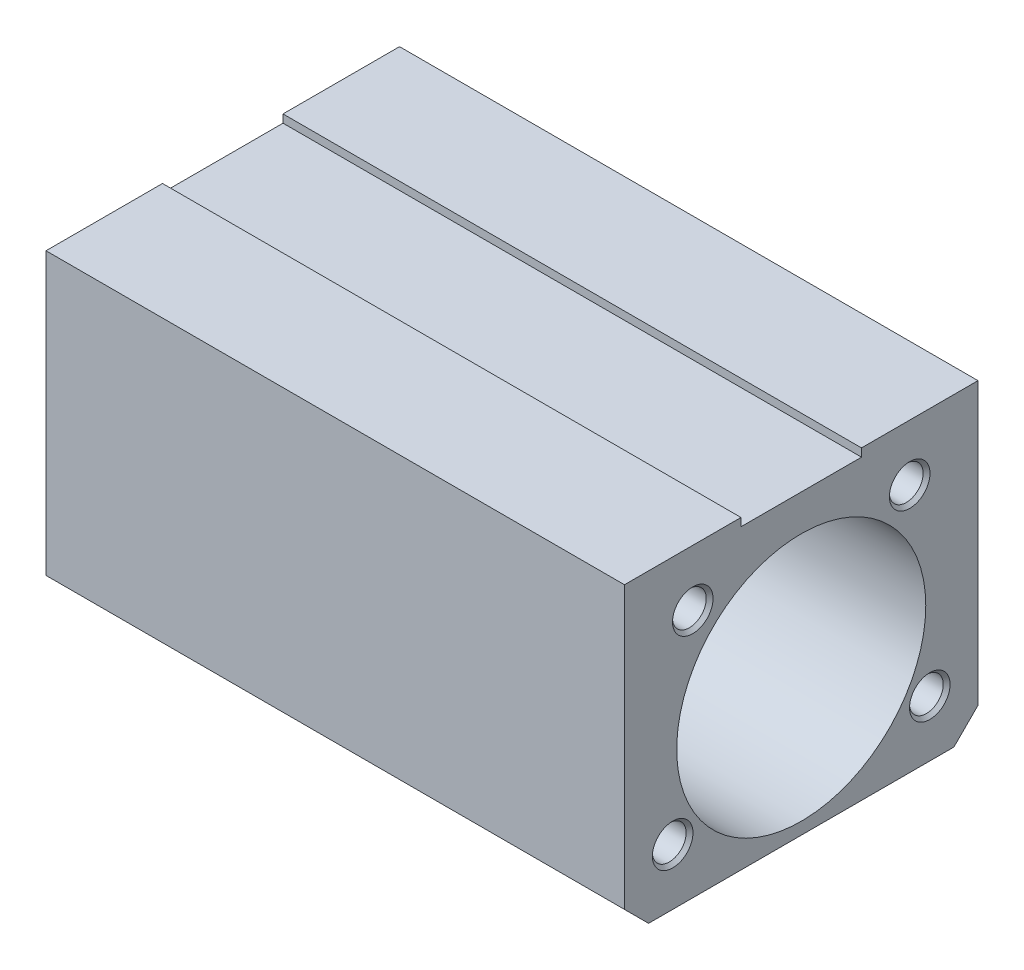
ISO-10303-21;
HEADER;
FILE_DESCRIPTION(('STEP AP214'),'2;1');
FILE_NAME('part.step','',(''),(''),'','','');
FILE_SCHEMA(('AUTOMOTIVE_DESIGN { 1 0 10303 214 1 1 1 1 }'));
ENDSEC;
DATA;
#1=APPLICATION_CONTEXT('core data for automotive mechanical design processes');
#2=APPLICATION_PROTOCOL_DEFINITION('international standard','automotive_design',2000,#1);
#3=PRODUCT_CONTEXT('',#1,'mechanical');
#4=PRODUCT('Part','Part','',(#3));
#5=PRODUCT_RELATED_PRODUCT_CATEGORY('part','',(#4));
#6=PRODUCT_DEFINITION_FORMATION('','',#4);
#7=PRODUCT_DEFINITION_CONTEXT('part definition',#1,'design');
#8=PRODUCT_DEFINITION('design','',#6,#7);
#9=PRODUCT_DEFINITION_SHAPE('','',#8);
#10=(LENGTH_UNIT() NAMED_UNIT(*) SI_UNIT(.MILLI.,.METRE.));
#11=(NAMED_UNIT(*) PLANE_ANGLE_UNIT() SI_UNIT($,.RADIAN.));
#12=(NAMED_UNIT(*) SI_UNIT($,.STERADIAN.) SOLID_ANGLE_UNIT());
#13=UNCERTAINTY_MEASURE_WITH_UNIT(LENGTH_MEASURE(1.E-05),#10,'distance_accuracy_value','');
#14=(GEOMETRIC_REPRESENTATION_CONTEXT(3) GLOBAL_UNCERTAINTY_ASSIGNED_CONTEXT((#13)) GLOBAL_UNIT_ASSIGNED_CONTEXT((#10,
#11,#12)) REPRESENTATION_CONTEXT('',''));
#15=CARTESIAN_POINT('',(0.,0.,0.));
#16=DIRECTION('',(0.,0.,1.));
#17=DIRECTION('',(1.,0.,0.));
#18=AXIS2_PLACEMENT_3D('',#15,#16,#17);
#19=CARTESIAN_POINT('',(-72.,38.,0.));
#20=DIRECTION('',(0.,1.,0.));
#21=DIRECTION('',(0.,0.,1.));
#22=AXIS2_PLACEMENT_3D('',#19,#20,#21);
#23=PLANE('',#22);
#24=DIRECTION('',(1.,0.,0.));
#25=VECTOR('',#24,1.);
#26=CARTESIAN_POINT('',(-72.,38.,-14.5));
#27=LINE('',#26,#25);
#28=CARTESIAN_POINT('',(-72.,38.,-14.5));
#29=VERTEX_POINT('',#28);
#30=CARTESIAN_POINT('',(0.,38.,-14.5));
#31=VERTEX_POINT('',#30);
#32=EDGE_CURVE('E161',#29,#31,#27,.T.);
#33=ORIENTED_EDGE('',*,*,#32,.F.);
#34=DIRECTION('',(0.,0.,1.));
#35=VECTOR('',#34,1.);
#36=CARTESIAN_POINT('',(-72.,38.,0.));
#37=LINE('',#36,#35);
#38=CARTESIAN_POINT('',(-72.,38.,0.));
#39=VERTEX_POINT('',#38);
#40=EDGE_CURVE('E152',#29,#39,#37,.T.);
#41=ORIENTED_EDGE('',*,*,#40,.T.);
#42=DIRECTION('',(1.,0.,0.));
#43=VECTOR('',#42,1.);
#44=CARTESIAN_POINT('',(-72.,38.,0.));
#45=LINE('',#44,#43);
#46=CARTESIAN_POINT('',(0.,38.,0.));
#47=VERTEX_POINT('',#46);
#48=EDGE_CURVE('E238',#39,#47,#45,.T.);
#49=ORIENTED_EDGE('',*,*,#48,.T.);
#50=DIRECTION('',(0.,0.,1.));
#51=VECTOR('',#50,1.);
#52=CARTESIAN_POINT('',(0.,38.,0.));
#53=LINE('',#52,#51);
#54=EDGE_CURVE('E235',#31,#47,#53,.T.);
#55=ORIENTED_EDGE('',*,*,#54,.F.);
#56=EDGE_LOOP('',(#33,#41,#49,#55));
#57=FACE_BOUND('',#56,.T.);
#58=ADVANCED_FACE('F42',(#57),#23,.T.);
#59=CARTESIAN_POINT('',(-72.,0.,0.));
#60=DIRECTION('',(0.,0.,1.));
#61=DIRECTION('',(1.,0.,0.));
#62=AXIS2_PLACEMENT_3D('',#59,#60,#61);
#63=PLANE('',#62);
#64=DIRECTION('',(0.,-1.,0.));
#65=VECTOR('',#64,1.);
#66=CARTESIAN_POINT('',(-72.,0.,0.));
#67=LINE('',#66,#65);
#68=CARTESIAN_POINT('',(-72.,3.00000000000002,0.));
#69=VERTEX_POINT('',#68);
#70=EDGE_CURVE('E216',#39,#69,#67,.T.);
#71=ORIENTED_EDGE('',*,*,#70,.T.);
#72=DIRECTION('',(1.,0.,0.));
#73=VECTOR('',#72,1.);
#74=CARTESIAN_POINT('',(-72.,3.00000000000002,0.));
#75=LINE('',#74,#73);
#76=CARTESIAN_POINT('',(0.,3.00000000000002,0.));
#77=VERTEX_POINT('',#76);
#78=EDGE_CURVE('E11',#69,#77,#75,.T.);
#79=ORIENTED_EDGE('',*,*,#78,.T.);
#80=DIRECTION('',(0.,-1.,0.));
#81=VECTOR('',#80,1.);
#82=CARTESIAN_POINT('',(0.,0.,0.));
#83=LINE('',#82,#81);
#84=EDGE_CURVE('E213',#47,#77,#83,.T.);
#85=ORIENTED_EDGE('',*,*,#84,.F.);
#86=ORIENTED_EDGE('',*,*,#48,.F.);
#87=EDGE_LOOP('',(#71,#79,#85,#86));
#88=FACE_BOUND('',#87,.T.);
#89=ADVANCED_FACE('F286',(#88),#63,.T.);
#90=DIRECTION('',(1.,0.,0.));
#91=VECTOR('',#90,1.);
#92=CARTESIAN_POINT('',(-72.,38.,-29.5));
#93=LINE('',#92,#91);
#94=CARTESIAN_POINT('',(-72.,38.,-29.5));
#95=VERTEX_POINT('',#94);
#96=CARTESIAN_POINT('',(0.,38.,-29.5));
#97=VERTEX_POINT('',#96);
#98=EDGE_CURVE('E164',#95,#97,#93,.T.);
#99=ORIENTED_EDGE('',*,*,#98,.T.);
#100=CARTESIAN_POINT('',(0.,38.,-44.));
#101=VERTEX_POINT('',#100);
#102=EDGE_CURVE('E219',#101,#97,#53,.T.);
#103=ORIENTED_EDGE('',*,*,#102,.F.);
#104=DIRECTION('',(1.,0.,0.));
#105=VECTOR('',#104,1.);
#106=CARTESIAN_POINT('',(-72.,38.,-44.));
#107=LINE('',#106,#105);
#108=CARTESIAN_POINT('',(-72.,38.,-44.));
#109=VERTEX_POINT('',#108);
#110=EDGE_CURVE('E227',#109,#101,#107,.T.);
#111=ORIENTED_EDGE('',*,*,#110,.F.);
#112=EDGE_CURVE('E224',#109,#95,#37,.T.);
#113=ORIENTED_EDGE('',*,*,#112,.T.);
#114=EDGE_LOOP('',(#99,#103,#111,#113));
#115=FACE_BOUND('',#114,.T.);
#116=ADVANCED_FACE('F273',(#115),#23,.T.);
#117=CARTESIAN_POINT('',(-72.,0.,-44.));
#118=DIRECTION('',(0.,0.,-1.));
#119=DIRECTION('',(-1.,0.,0.));
#120=AXIS2_PLACEMENT_3D('',#117,#118,#119);
#121=PLANE('',#120);
#122=DIRECTION('',(0.,1.,0.));
#123=VECTOR('',#122,1.);
#124=CARTESIAN_POINT('',(0.,0.,-44.));
#125=LINE('',#124,#123);
#126=CARTESIAN_POINT('',(0.,3.00000000000003,-44.));
#127=VERTEX_POINT('',#126);
#128=EDGE_CURVE('E233',#127,#101,#125,.T.);
#129=ORIENTED_EDGE('',*,*,#128,.F.);
#130=DIRECTION('',(-1.,0.,0.));
#131=VECTOR('',#130,1.);
#132=CARTESIAN_POINT('',(-72.,3.00000000000003,-44.));
#133=LINE('',#132,#131);
#134=CARTESIAN_POINT('',(-72.,3.00000000000003,-44.));
#135=VERTEX_POINT('',#134);
#136=EDGE_CURVE('E252',#127,#135,#133,.T.);
#137=ORIENTED_EDGE('',*,*,#136,.T.);
#138=DIRECTION('',(0.,1.,0.));
#139=VECTOR('',#138,1.);
#140=CARTESIAN_POINT('',(-72.,0.,-44.));
#141=LINE('',#140,#139);
#142=EDGE_CURVE('E222',#135,#109,#141,.T.);
#143=ORIENTED_EDGE('',*,*,#142,.T.);
#144=ORIENTED_EDGE('',*,*,#110,.T.);
#145=EDGE_LOOP('',(#129,#137,#143,#144));
#146=FACE_BOUND('',#145,.T.);
#147=ADVANCED_FACE('F269',(#146),#121,.T.);
#148=CARTESIAN_POINT('',(-72.,0.,0.));
#149=DIRECTION('',(0.,-1.,0.));
#150=DIRECTION('',(0.,0.,-1.));
#151=AXIS2_PLACEMENT_3D('',#148,#149,#150);
#152=PLANE('',#151);
#153=DIRECTION('',(0.,0.,-1.));
#154=VECTOR('',#153,1.);
#155=CARTESIAN_POINT('',(-72.,0.,0.));
#156=LINE('',#155,#154);
#157=CARTESIAN_POINT('',(-72.,0.,-3.00000000000003));
#158=VERTEX_POINT('',#157);
#159=CARTESIAN_POINT('',(-72.,0.,-41.));
#160=VERTEX_POINT('',#159);
#161=EDGE_CURVE('E218',#158,#160,#156,.T.);
#162=ORIENTED_EDGE('',*,*,#161,.T.);
#163=DIRECTION('',(1.,0.,0.));
#164=VECTOR('',#163,1.);
#165=CARTESIAN_POINT('',(-72.,0.,-41.));
#166=LINE('',#165,#164);
#167=CARTESIAN_POINT('',(0.,0.,-41.));
#168=VERTEX_POINT('',#167);
#169=EDGE_CURVE('E245',#160,#168,#166,.T.);
#170=ORIENTED_EDGE('',*,*,#169,.T.);
#171=DIRECTION('',(0.,0.,-1.));
#172=VECTOR('',#171,1.);
#173=CARTESIAN_POINT('',(0.,0.,0.));
#174=LINE('',#173,#172);
#175=CARTESIAN_POINT('',(0.,0.,-3.00000000000003));
#176=VERTEX_POINT('',#175);
#177=EDGE_CURVE('E230',#176,#168,#174,.T.);
#178=ORIENTED_EDGE('',*,*,#177,.F.);
#179=DIRECTION('',(-1.,0.,0.));
#180=VECTOR('',#179,1.);
#181=CARTESIAN_POINT('',(-72.,0.,-3.00000000000003));
#182=LINE('',#181,#180);
#183=EDGE_CURVE('E241',#176,#158,#182,.T.);
#184=ORIENTED_EDGE('',*,*,#183,.T.);
#185=EDGE_LOOP('',(#162,#170,#178,#184));
#186=FACE_BOUND('',#185,.T.);
#187=ADVANCED_FACE('F261',(#186),#152,.T.);
#188=CARTESIAN_POINT('',(-72.,0.,0.));
#189=DIRECTION('',(-1.,0.,0.));
#190=DIRECTION('',(0.,0.,1.));
#191=AXIS2_PLACEMENT_3D('',#188,#189,#190);
#192=PLANE('',#191);
#193=DIRECTION('',(0.,-1.,0.));
#194=VECTOR('',#193,1.);
#195=CARTESIAN_POINT('',(-72.,38.,-14.5));
#196=LINE('',#195,#194);
#197=CARTESIAN_POINT('',(-72.,37.,-14.5));
#198=VERTEX_POINT('',#197);
#199=EDGE_CURVE('E135',#29,#198,#196,.T.);
#200=ORIENTED_EDGE('',*,*,#199,.T.);
#201=DIRECTION('',(0.,0.,-1.));
#202=VECTOR('',#201,1.);
#203=CARTESIAN_POINT('',(-72.,37.,-14.5));
#204=LINE('',#203,#202);
#205=CARTESIAN_POINT('',(-72.,37.,-29.5));
#206=VERTEX_POINT('',#205);
#207=EDGE_CURVE('E144',#198,#206,#204,.T.);
#208=ORIENTED_EDGE('',*,*,#207,.T.);
#209=DIRECTION('',(0.,1.,0.));
#210=VECTOR('',#209,1.);
#211=CARTESIAN_POINT('',(-72.,38.,-29.5));
#212=LINE('',#211,#210);
#213=EDGE_CURVE('E141',#206,#95,#212,.T.);
#214=ORIENTED_EDGE('',*,*,#213,.T.);
#215=ORIENTED_EDGE('',*,*,#112,.F.);
#216=ORIENTED_EDGE('',*,*,#142,.F.);
#217=DIRECTION('',(0.,0.707106781186551,-0.707106781186544));
#218=VECTOR('',#217,1.);
#219=CARTESIAN_POINT('',(-72.,-20.5,-20.5000000000002));
#220=LINE('',#219,#218);
#221=EDGE_CURVE('E51',#135,#160,#220,.F.);
#222=ORIENTED_EDGE('',*,*,#221,.T.);
#223=ORIENTED_EDGE('',*,*,#161,.F.);
#224=DIRECTION('',(0.,-0.707106781186546,-0.707106781186549));
#225=VECTOR('',#224,1.);
#226=CARTESIAN_POINT('',(-72.,1.50000000000002,-1.50000000000001));
#227=LINE('',#226,#225);
#228=EDGE_CURVE('E66',#158,#69,#227,.F.);
#229=ORIENTED_EDGE('',*,*,#228,.T.);
#230=ORIENTED_EDGE('',*,*,#70,.F.);
#231=ORIENTED_EDGE('',*,*,#40,.F.);
#232=EDGE_LOOP('',(#200,#208,#214,#215,#216,#222,#223,#229,#230,#231));
#233=FACE_BOUND('',#232,.T.);
#234=CARTESIAN_POINT('',(-72.,17.,-22.));
#235=DIRECTION('',(1.,0.,0.));
#236=DIRECTION('',(0.,0.,-1.));
#237=AXIS2_PLACEMENT_3D('',#234,#235,#236);
#238=CIRCLE('',#237,9.);
#239=CARTESIAN_POINT('',(-72.,17.,-31.));
#240=VERTEX_POINT('',#239);
#241=EDGE_CURVE('E204',#240,#240,#238,.T.);
#242=ORIENTED_EDGE('',*,*,#241,.T.);
#243=EDGE_LOOP('',(#242));
#244=FACE_BOUND('',#243,.T.);
#245=ADVANCED_FACE('F150',(#233,#244),#192,.T.);
#246=CARTESIAN_POINT('',(0.,0.,0.));
#247=DIRECTION('',(-1.,0.,0.));
#248=DIRECTION('',(0.,0.,1.));
#249=AXIS2_PLACEMENT_3D('',#246,#247,#248);
#250=PLANE('',#249);
#251=CARTESIAN_POINT('',(0.,31.,-8.50000000000001));
#252=DIRECTION('',(1.,0.,0.));
#253=DIRECTION('',(0.,0.,-1.));
#254=AXIS2_PLACEMENT_3D('',#251,#252,#253);
#255=CIRCLE('',#254,2.525);
#256=CARTESIAN_POINT('',(0.,31.,-11.025));
#257=VERTEX_POINT('',#256);
#258=EDGE_CURVE('E163',#257,#257,#255,.T.);
#259=ORIENTED_EDGE('',*,*,#258,.F.);
#260=EDGE_LOOP('',(#259));
#261=FACE_BOUND('',#260,.T.);
#262=CARTESIAN_POINT('',(0.,31.,-35.5));
#263=DIRECTION('',(1.,0.,0.));
#264=DIRECTION('',(0.,0.,-1.));
#265=AXIS2_PLACEMENT_3D('',#262,#263,#264);
#266=CIRCLE('',#265,2.525);
#267=CARTESIAN_POINT('',(0.,31.,-38.025));
#268=VERTEX_POINT('',#267);
#269=EDGE_CURVE('E176',#268,#268,#266,.T.);
#270=ORIENTED_EDGE('',*,*,#269,.F.);
#271=EDGE_LOOP('',(#270));
#272=FACE_BOUND('',#271,.T.);
#273=CARTESIAN_POINT('',(0.,7.,-38.));
#274=DIRECTION('',(1.,0.,0.));
#275=DIRECTION('',(0.,0.,-1.));
#276=AXIS2_PLACEMENT_3D('',#273,#274,#275);
#277=CIRCLE('',#276,2.525);
#278=CARTESIAN_POINT('',(0.,7.,-40.525));
#279=VERTEX_POINT('',#278);
#280=EDGE_CURVE('E185',#279,#279,#277,.T.);
#281=ORIENTED_EDGE('',*,*,#280,.F.);
#282=EDGE_LOOP('',(#281));
#283=FACE_BOUND('',#282,.T.);
#284=CARTESIAN_POINT('',(0.,7.,-6.));
#285=DIRECTION('',(1.,0.,0.));
#286=DIRECTION('',(0.,0.,-1.));
#287=AXIS2_PLACEMENT_3D('',#284,#285,#286);
#288=CIRCLE('',#287,2.525);
#289=CARTESIAN_POINT('',(0.,7.,-8.525));
#290=VERTEX_POINT('',#289);
#291=EDGE_CURVE('E194',#290,#290,#288,.T.);
#292=ORIENTED_EDGE('',*,*,#291,.F.);
#293=EDGE_LOOP('',(#292));
#294=FACE_BOUND('',#293,.T.);
#295=CARTESIAN_POINT('',(0.,17.,-22.));
#296=DIRECTION('',(1.,0.,0.));
#297=DIRECTION('',(0.,0.,-1.));
#298=AXIS2_PLACEMENT_3D('',#295,#296,#297);
#299=CIRCLE('',#298,15.5);
#300=CARTESIAN_POINT('',(0.,17.,-37.5));
#301=VERTEX_POINT('',#300);
#302=EDGE_CURVE('E207',#301,#301,#299,.T.);
#303=ORIENTED_EDGE('',*,*,#302,.F.);
#304=EDGE_LOOP('',(#303));
#305=FACE_BOUND('',#304,.T.);
#306=DIRECTION('',(0.,0.,-1.));
#307=VECTOR('',#306,1.);
#308=CARTESIAN_POINT('',(0.,37.,-14.5));
#309=LINE('',#308,#307);
#310=CARTESIAN_POINT('',(0.,37.,-14.5));
#311=VERTEX_POINT('',#310);
#312=CARTESIAN_POINT('',(0.,37.,-29.5));
#313=VERTEX_POINT('',#312);
#314=EDGE_CURVE('E155',#311,#313,#309,.T.);
#315=ORIENTED_EDGE('',*,*,#314,.F.);
#316=DIRECTION('',(0.,-1.,0.));
#317=VECTOR('',#316,1.);
#318=CARTESIAN_POINT('',(0.,38.,-14.5));
#319=LINE('',#318,#317);
#320=EDGE_CURVE('E58',#31,#311,#319,.T.);
#321=ORIENTED_EDGE('',*,*,#320,.F.);
#322=ORIENTED_EDGE('',*,*,#54,.T.);
#323=ORIENTED_EDGE('',*,*,#84,.T.);
#324=DIRECTION('',(0.,0.707106781186546,0.707106781186549));
#325=VECTOR('',#324,1.);
#326=CARTESIAN_POINT('',(0.,3.00000000000002,0.));
#327=LINE('',#326,#325);
#328=EDGE_CURVE('E248',#77,#176,#327,.F.);
#329=ORIENTED_EDGE('',*,*,#328,.T.);
#330=ORIENTED_EDGE('',*,*,#177,.T.);
#331=DIRECTION('',(0.,-0.707106781186551,0.707106781186544));
#332=VECTOR('',#331,1.);
#333=CARTESIAN_POINT('',(0.,0.,-41.));
#334=LINE('',#333,#332);
#335=EDGE_CURVE('E250',#168,#127,#334,.F.);
#336=ORIENTED_EDGE('',*,*,#335,.T.);
#337=ORIENTED_EDGE('',*,*,#128,.T.);
#338=ORIENTED_EDGE('',*,*,#102,.T.);
#339=DIRECTION('',(0.,1.,0.));
#340=VECTOR('',#339,1.);
#341=CARTESIAN_POINT('',(0.,38.,-29.5));
#342=LINE('',#341,#340);
#343=EDGE_CURVE('E153',#313,#97,#342,.T.);
#344=ORIENTED_EDGE('',*,*,#343,.F.);
#345=EDGE_LOOP('',(#315,#321,#322,#323,#329,#330,#336,#337,#338,#344));
#346=FACE_BOUND('',#345,.T.);
#347=ADVANCED_FACE('F267',(#261,#272,#283,#294,#305,#346),#250,.F.);
#348=CARTESIAN_POINT('',(-66.,17.,-22.));
#349=DIRECTION('',(1.,0.,0.));
#350=DIRECTION('',(0.,0.,-1.));
#351=AXIS2_PLACEMENT_3D('',#348,#349,#350);
#352=CYLINDRICAL_SURFACE('',#351,15.5);
#353=CARTESIAN_POINT('',(-66.,17.,-22.));
#354=DIRECTION('',(1.,0.,0.));
#355=DIRECTION('',(0.,0.,-1.));
#356=AXIS2_PLACEMENT_3D('',#353,#354,#355);
#357=CIRCLE('',#356,15.5);
#358=CARTESIAN_POINT('',(-66.,17.,-37.5));
#359=VERTEX_POINT('',#358);
#360=EDGE_CURVE('E210',#359,#359,#357,.T.);
#361=ORIENTED_EDGE('',*,*,#360,.F.);
#362=EDGE_LOOP('',(#361));
#363=FACE_BOUND('',#362,.T.);
#364=ORIENTED_EDGE('',*,*,#302,.T.);
#365=EDGE_LOOP('',(#364));
#366=FACE_BOUND('',#365,.T.);
#367=ADVANCED_FACE('F372',(#363,#366),#352,.F.);
#368=CARTESIAN_POINT('',(-66.,17.,-22.));
#369=DIRECTION('',(1.,0.,0.));
#370=DIRECTION('',(0.,0.,-1.));
#371=AXIS2_PLACEMENT_3D('',#368,#369,#370);
#372=PLANE('',#371);
#373=CARTESIAN_POINT('',(-66.,17.,-22.));
#374=DIRECTION('',(1.,0.,0.));
#375=DIRECTION('',(0.,0.,-1.));
#376=AXIS2_PLACEMENT_3D('',#373,#374,#375);
#377=CIRCLE('',#376,9.);
#378=CARTESIAN_POINT('',(-66.,17.,-31.));
#379=VERTEX_POINT('',#378);
#380=EDGE_CURVE('E203',#379,#379,#377,.T.);
#381=ORIENTED_EDGE('',*,*,#380,.F.);
#382=EDGE_LOOP('',(#381));
#383=FACE_BOUND('',#382,.T.);
#384=ORIENTED_EDGE('',*,*,#360,.T.);
#385=EDGE_LOOP('',(#384));
#386=FACE_BOUND('',#385,.T.);
#387=ADVANCED_FACE('F368',(#383,#386),#372,.T.);
#388=CARTESIAN_POINT('',(-72.,17.,-22.));
#389=DIRECTION('',(1.,0.,0.));
#390=DIRECTION('',(0.,0.,-1.));
#391=AXIS2_PLACEMENT_3D('',#388,#389,#390);
#392=CYLINDRICAL_SURFACE('',#391,9.);
#393=ORIENTED_EDGE('',*,*,#241,.F.);
#394=EDGE_LOOP('',(#393));
#395=FACE_BOUND('',#394,.T.);
#396=ORIENTED_EDGE('',*,*,#380,.T.);
#397=EDGE_LOOP('',(#396));
#398=FACE_BOUND('',#397,.T.);
#399=ADVANCED_FACE('F364',(#395,#398),#392,.F.);
#400=CARTESIAN_POINT('',(-16.7381927000421,7.,-6.));
#401=DIRECTION('',(1.,0.,0.));
#402=DIRECTION('',(0.,0.,-1.));
#403=AXIS2_PLACEMENT_3D('',#400,#401,#402);
#404=CONICAL_SURFACE('',#403,2.1,1.02974425867665);
#405=CARTESIAN_POINT('',(-18.,7.,-6.));
#406=VERTEX_POINT('',#405);
#407=VERTEX_LOOP('',#406);
#408=FACE_BOUND('',#407,.T.);
#409=CARTESIAN_POINT('',(-16.7381927000421,7.,-6.));
#410=DIRECTION('',(1.,0.,0.));
#411=DIRECTION('',(0.,0.,-1.));
#412=AXIS2_PLACEMENT_3D('',#409,#410,#411);
#413=CIRCLE('',#412,2.1);
#414=CARTESIAN_POINT('',(-16.7381927000421,7.,-8.09999999999999));
#415=VERTEX_POINT('',#414);
#416=EDGE_CURVE('E200',#415,#415,#413,.T.);
#417=ORIENTED_EDGE('',*,*,#416,.T.);
#418=EDGE_LOOP('',(#417));
#419=FACE_BOUND('',#418,.T.);
#420=ADVANCED_FACE('F360',(#408,#419),#404,.F.);
#421=CARTESIAN_POINT('',(0.,7.,-6.));
#422=DIRECTION('',(1.,0.,0.));
#423=DIRECTION('',(0.,0.,-1.));
#424=AXIS2_PLACEMENT_3D('',#421,#422,#423);
#425=CYLINDRICAL_SURFACE('',#424,2.1);
#426=ORIENTED_EDGE('',*,*,#416,.F.);
#427=EDGE_LOOP('',(#426));
#428=FACE_BOUND('',#427,.T.);
#429=CARTESIAN_POINT('',(-0.424999999999998,7.,-6.));
#430=DIRECTION('',(1.,0.,0.));
#431=DIRECTION('',(0.,0.,-1.));
#432=AXIS2_PLACEMENT_3D('',#429,#430,#431);
#433=CIRCLE('',#432,2.1);
#434=CARTESIAN_POINT('',(-0.424999999999998,7.,-8.1));
#435=VERTEX_POINT('',#434);
#436=EDGE_CURVE('E197',#435,#435,#433,.T.);
#437=ORIENTED_EDGE('',*,*,#436,.T.);
#438=EDGE_LOOP('',(#437));
#439=FACE_BOUND('',#438,.T.);
#440=ADVANCED_FACE('F356',(#428,#439),#425,.F.);
#441=CARTESIAN_POINT('',(0.,7.,-6.));
#442=DIRECTION('',(1.,0.,0.));
#443=DIRECTION('',(0.,0.,-1.));
#444=AXIS2_PLACEMENT_3D('',#441,#442,#443);
#445=CONICAL_SURFACE('',#444,2.525,0.78539816339745);
#446=ORIENTED_EDGE('',*,*,#436,.F.);
#447=EDGE_LOOP('',(#446));
#448=FACE_BOUND('',#447,.T.);
#449=ORIENTED_EDGE('',*,*,#291,.T.);
#450=EDGE_LOOP('',(#449));
#451=FACE_BOUND('',#450,.T.);
#452=ADVANCED_FACE('F352',(#448,#451),#445,.F.);
#453=CARTESIAN_POINT('',(-16.7381927000421,7.,-38.));
#454=DIRECTION('',(1.,0.,0.));
#455=DIRECTION('',(0.,0.,-1.));
#456=AXIS2_PLACEMENT_3D('',#453,#454,#455);
#457=CONICAL_SURFACE('',#456,2.1,1.02974425867665);
#458=CARTESIAN_POINT('',(-18.,7.,-38.));
#459=VERTEX_POINT('',#458);
#460=VERTEX_LOOP('',#459);
#461=FACE_BOUND('',#460,.T.);
#462=CARTESIAN_POINT('',(-16.7381927000421,7.,-38.));
#463=DIRECTION('',(1.,0.,0.));
#464=DIRECTION('',(0.,0.,-1.));
#465=AXIS2_PLACEMENT_3D('',#462,#463,#464);
#466=CIRCLE('',#465,2.1);
#467=CARTESIAN_POINT('',(-16.7381927000421,7.,-40.1));
#468=VERTEX_POINT('',#467);
#469=EDGE_CURVE('E191',#468,#468,#466,.T.);
#470=ORIENTED_EDGE('',*,*,#469,.T.);
#471=EDGE_LOOP('',(#470));
#472=FACE_BOUND('',#471,.T.);
#473=ADVANCED_FACE('F348',(#461,#472),#457,.F.);
#474=CARTESIAN_POINT('',(0.,7.,-38.));
#475=DIRECTION('',(1.,0.,0.));
#476=DIRECTION('',(0.,0.,-1.));
#477=AXIS2_PLACEMENT_3D('',#474,#475,#476);
#478=CYLINDRICAL_SURFACE('',#477,2.1);
#479=ORIENTED_EDGE('',*,*,#469,.F.);
#480=EDGE_LOOP('',(#479));
#481=FACE_BOUND('',#480,.T.);
#482=CARTESIAN_POINT('',(-0.424999999999998,7.,-38.));
#483=DIRECTION('',(1.,0.,0.));
#484=DIRECTION('',(0.,0.,-1.));
#485=AXIS2_PLACEMENT_3D('',#482,#483,#484);
#486=CIRCLE('',#485,2.1);
#487=CARTESIAN_POINT('',(-0.424999999999998,7.,-40.1));
#488=VERTEX_POINT('',#487);
#489=EDGE_CURVE('E188',#488,#488,#486,.T.);
#490=ORIENTED_EDGE('',*,*,#489,.T.);
#491=EDGE_LOOP('',(#490));
#492=FACE_BOUND('',#491,.T.);
#493=ADVANCED_FACE('F344',(#481,#492),#478,.F.);
#494=CARTESIAN_POINT('',(0.,7.,-38.));
#495=DIRECTION('',(1.,0.,0.));
#496=DIRECTION('',(0.,0.,-1.));
#497=AXIS2_PLACEMENT_3D('',#494,#495,#496);
#498=CONICAL_SURFACE('',#497,2.525,0.78539816339745);
#499=ORIENTED_EDGE('',*,*,#489,.F.);
#500=EDGE_LOOP('',(#499));
#501=FACE_BOUND('',#500,.T.);
#502=ORIENTED_EDGE('',*,*,#280,.T.);
#503=EDGE_LOOP('',(#502));
#504=FACE_BOUND('',#503,.T.);
#505=ADVANCED_FACE('F340',(#501,#504),#498,.F.);
#506=CARTESIAN_POINT('',(-16.7381927000421,31.,-35.5));
#507=DIRECTION('',(1.,0.,0.));
#508=DIRECTION('',(0.,0.,-1.));
#509=AXIS2_PLACEMENT_3D('',#506,#507,#508);
#510=CONICAL_SURFACE('',#509,2.1,1.02974425867665);
#511=CARTESIAN_POINT('',(-18.,31.,-35.5));
#512=VERTEX_POINT('',#511);
#513=VERTEX_LOOP('',#512);
#514=FACE_BOUND('',#513,.T.);
#515=CARTESIAN_POINT('',(-16.7381927000421,31.,-35.5));
#516=DIRECTION('',(1.,0.,0.));
#517=DIRECTION('',(0.,0.,-1.));
#518=AXIS2_PLACEMENT_3D('',#515,#516,#517);
#519=CIRCLE('',#518,2.1);
#520=CARTESIAN_POINT('',(-16.7381927000421,31.,-37.6));
#521=VERTEX_POINT('',#520);
#522=EDGE_CURVE('E182',#521,#521,#519,.T.);
#523=ORIENTED_EDGE('',*,*,#522,.T.);
#524=EDGE_LOOP('',(#523));
#525=FACE_BOUND('',#524,.T.);
#526=ADVANCED_FACE('F336',(#514,#525),#510,.F.);
#527=CARTESIAN_POINT('',(0.,31.,-35.5));
#528=DIRECTION('',(1.,0.,0.));
#529=DIRECTION('',(0.,0.,-1.));
#530=AXIS2_PLACEMENT_3D('',#527,#528,#529);
#531=CYLINDRICAL_SURFACE('',#530,2.1);
#532=ORIENTED_EDGE('',*,*,#522,.F.);
#533=EDGE_LOOP('',(#532));
#534=FACE_BOUND('',#533,.T.);
#535=CARTESIAN_POINT('',(-0.424999999999998,31.,-35.5));
#536=DIRECTION('',(1.,0.,0.));
#537=DIRECTION('',(0.,0.,-1.));
#538=AXIS2_PLACEMENT_3D('',#535,#536,#537);
#539=CIRCLE('',#538,2.1);
#540=CARTESIAN_POINT('',(-0.424999999999998,31.,-37.6));
#541=VERTEX_POINT('',#540);
#542=EDGE_CURVE('E179',#541,#541,#539,.T.);
#543=ORIENTED_EDGE('',*,*,#542,.T.);
#544=EDGE_LOOP('',(#543));
#545=FACE_BOUND('',#544,.T.);
#546=ADVANCED_FACE('F332',(#534,#545),#531,.F.);
#547=CARTESIAN_POINT('',(0.,31.,-35.5));
#548=DIRECTION('',(1.,0.,0.));
#549=DIRECTION('',(0.,0.,-1.));
#550=AXIS2_PLACEMENT_3D('',#547,#548,#549);
#551=CONICAL_SURFACE('',#550,2.525,0.785398163397452);
#552=ORIENTED_EDGE('',*,*,#542,.F.);
#553=EDGE_LOOP('',(#552));
#554=FACE_BOUND('',#553,.T.);
#555=ORIENTED_EDGE('',*,*,#269,.T.);
#556=EDGE_LOOP('',(#555));
#557=FACE_BOUND('',#556,.T.);
#558=ADVANCED_FACE('F328',(#554,#557),#551,.F.);
#559=CARTESIAN_POINT('',(-16.7381927000421,31.,-8.50000000000001));
#560=DIRECTION('',(1.,0.,0.));
#561=DIRECTION('',(0.,0.,-1.));
#562=AXIS2_PLACEMENT_3D('',#559,#560,#561);
#563=CONICAL_SURFACE('',#562,2.09999999999999,1.02974425867665);
#564=CARTESIAN_POINT('',(-18.,31.,-8.50000000000001));
#565=VERTEX_POINT('',#564);
#566=VERTEX_LOOP('',#565);
#567=FACE_BOUND('',#566,.T.);
#568=CARTESIAN_POINT('',(-16.7381927000421,31.,-8.50000000000001));
#569=DIRECTION('',(1.,0.,0.));
#570=DIRECTION('',(0.,0.,-1.));
#571=AXIS2_PLACEMENT_3D('',#568,#569,#570);
#572=CIRCLE('',#571,2.09999999999999);
#573=CARTESIAN_POINT('',(-16.7381927000421,31.,-10.6));
#574=VERTEX_POINT('',#573);
#575=EDGE_CURVE('E173',#574,#574,#572,.T.);
#576=ORIENTED_EDGE('',*,*,#575,.T.);
#577=EDGE_LOOP('',(#576));
#578=FACE_BOUND('',#577,.T.);
#579=ADVANCED_FACE('F320',(#567,#578),#563,.F.);
#580=CARTESIAN_POINT('',(0.,31.,-8.50000000000001));
#581=DIRECTION('',(1.,0.,0.));
#582=DIRECTION('',(0.,0.,-1.));
#583=AXIS2_PLACEMENT_3D('',#580,#581,#582);
#584=CYLINDRICAL_SURFACE('',#583,2.1);
#585=ORIENTED_EDGE('',*,*,#575,.F.);
#586=EDGE_LOOP('',(#585));
#587=FACE_BOUND('',#586,.T.);
#588=CARTESIAN_POINT('',(-0.424999999999998,31.,-8.50000000000001));
#589=DIRECTION('',(1.,0.,0.));
#590=DIRECTION('',(0.,0.,-1.));
#591=AXIS2_PLACEMENT_3D('',#588,#589,#590);
#592=CIRCLE('',#591,2.1);
#593=CARTESIAN_POINT('',(-0.424999999999998,31.,-10.6));
#594=VERTEX_POINT('',#593);
#595=EDGE_CURVE('E170',#594,#594,#592,.T.);
#596=ORIENTED_EDGE('',*,*,#595,.T.);
#597=EDGE_LOOP('',(#596));
#598=FACE_BOUND('',#597,.T.);
#599=ADVANCED_FACE('F314',(#587,#598),#584,.F.);
#600=CARTESIAN_POINT('',(0.,31.,-8.50000000000001));
#601=DIRECTION('',(1.,0.,0.));
#602=DIRECTION('',(0.,0.,-1.));
#603=AXIS2_PLACEMENT_3D('',#600,#601,#602);
#604=CONICAL_SURFACE('',#603,2.525,0.785398163397452);
#605=ORIENTED_EDGE('',*,*,#595,.F.);
#606=EDGE_LOOP('',(#605));
#607=FACE_BOUND('',#606,.T.);
#608=ORIENTED_EDGE('',*,*,#258,.T.);
#609=EDGE_LOOP('',(#608));
#610=FACE_BOUND('',#609,.T.);
#611=ADVANCED_FACE('F308',(#607,#610),#604,.F.);
#612=CARTESIAN_POINT('',(-72.,0.,-41.));
#613=DIRECTION('',(0.,0.707106781186544,0.707106781186551));
#614=DIRECTION('',(1.,0.,0.));
#615=AXIS2_PLACEMENT_3D('',#612,#613,#614);
#616=PLANE('',#615);
#617=ORIENTED_EDGE('',*,*,#221,.F.);
#618=ORIENTED_EDGE('',*,*,#136,.F.);
#619=ORIENTED_EDGE('',*,*,#335,.F.);
#620=ORIENTED_EDGE('',*,*,#169,.F.);
#621=EDGE_LOOP('',(#617,#618,#619,#620));
#622=FACE_BOUND('',#621,.T.);
#623=ADVANCED_FACE('F264',(#622),#616,.F.);
#624=CARTESIAN_POINT('',(-72.,3.00000000000002,0.));
#625=DIRECTION('',(0.,0.707106781186549,-0.707106781186546));
#626=DIRECTION('',(1.,0.,0.));
#627=AXIS2_PLACEMENT_3D('',#624,#625,#626);
#628=PLANE('',#627);
#629=ORIENTED_EDGE('',*,*,#228,.F.);
#630=ORIENTED_EDGE('',*,*,#183,.F.);
#631=ORIENTED_EDGE('',*,*,#328,.F.);
#632=ORIENTED_EDGE('',*,*,#78,.F.);
#633=EDGE_LOOP('',(#629,#630,#631,#632));
#634=FACE_BOUND('',#633,.T.);
#635=ADVANCED_FACE('F45',(#634),#628,.F.);
#636=CARTESIAN_POINT('',(-72.,38.,-14.5));
#637=DIRECTION('',(0.,0.,1.));
#638=DIRECTION('',(1.,0.,0.));
#639=AXIS2_PLACEMENT_3D('',#636,#637,#638);
#640=PLANE('',#639);
#641=ORIENTED_EDGE('',*,*,#320,.T.);
#642=DIRECTION('',(1.,0.,0.));
#643=VECTOR('',#642,1.);
#644=CARTESIAN_POINT('',(-72.,37.,-14.5));
#645=LINE('',#644,#643);
#646=EDGE_CURVE('E131',#198,#311,#645,.T.);
#647=ORIENTED_EDGE('',*,*,#646,.F.);
#648=ORIENTED_EDGE('',*,*,#199,.F.);
#649=ORIENTED_EDGE('',*,*,#32,.T.);
#650=EDGE_LOOP('',(#641,#647,#648,#649));
#651=FACE_BOUND('',#650,.T.);
#652=ADVANCED_FACE('F133',(#651),#640,.F.);
#653=CARTESIAN_POINT('',(-72.,38.,-29.5));
#654=DIRECTION('',(0.,0.,-1.));
#655=DIRECTION('',(-1.,0.,0.));
#656=AXIS2_PLACEMENT_3D('',#653,#654,#655);
#657=PLANE('',#656);
#658=ORIENTED_EDGE('',*,*,#343,.T.);
#659=ORIENTED_EDGE('',*,*,#98,.F.);
#660=ORIENTED_EDGE('',*,*,#213,.F.);
#661=DIRECTION('',(1.,0.,0.));
#662=VECTOR('',#661,1.);
#663=CARTESIAN_POINT('',(-72.,37.,-29.5));
#664=LINE('',#663,#662);
#665=EDGE_CURVE('E140',#206,#313,#664,.T.);
#666=ORIENTED_EDGE('',*,*,#665,.T.);
#667=EDGE_LOOP('',(#658,#659,#660,#666));
#668=FACE_BOUND('',#667,.T.);
#669=ADVANCED_FACE('F276',(#668),#657,.F.);
#670=CARTESIAN_POINT('',(-72.,37.,-14.5));
#671=DIRECTION('',(0.,-1.,0.));
#672=DIRECTION('',(0.,0.,-1.));
#673=AXIS2_PLACEMENT_3D('',#670,#671,#672);
#674=PLANE('',#673);
#675=ORIENTED_EDGE('',*,*,#314,.T.);
#676=ORIENTED_EDGE('',*,*,#665,.F.);
#677=ORIENTED_EDGE('',*,*,#207,.F.);
#678=ORIENTED_EDGE('',*,*,#646,.T.);
#679=EDGE_LOOP('',(#675,#676,#677,#678));
#680=FACE_BOUND('',#679,.T.);
#681=ADVANCED_FACE('F145',(#680),#674,.F.);
#682=CLOSED_SHELL('',(#58,#89,#116,#147,#187,#245,#347,#367,#387,#399,#420,#440,#452,#473,#493,
#505,#526,#546,#558,#579,#599,#611,#623,#635,#652,#669,#681));
#683=MANIFOLD_SOLID_BREP('B2',#682);
#684=ADVANCED_BREP_SHAPE_REPRESENTATION('',(#18,#683),#14);
#685=SHAPE_DEFINITION_REPRESENTATION(#9,#684);
ENDSEC;
END-ISO-10303-21;
